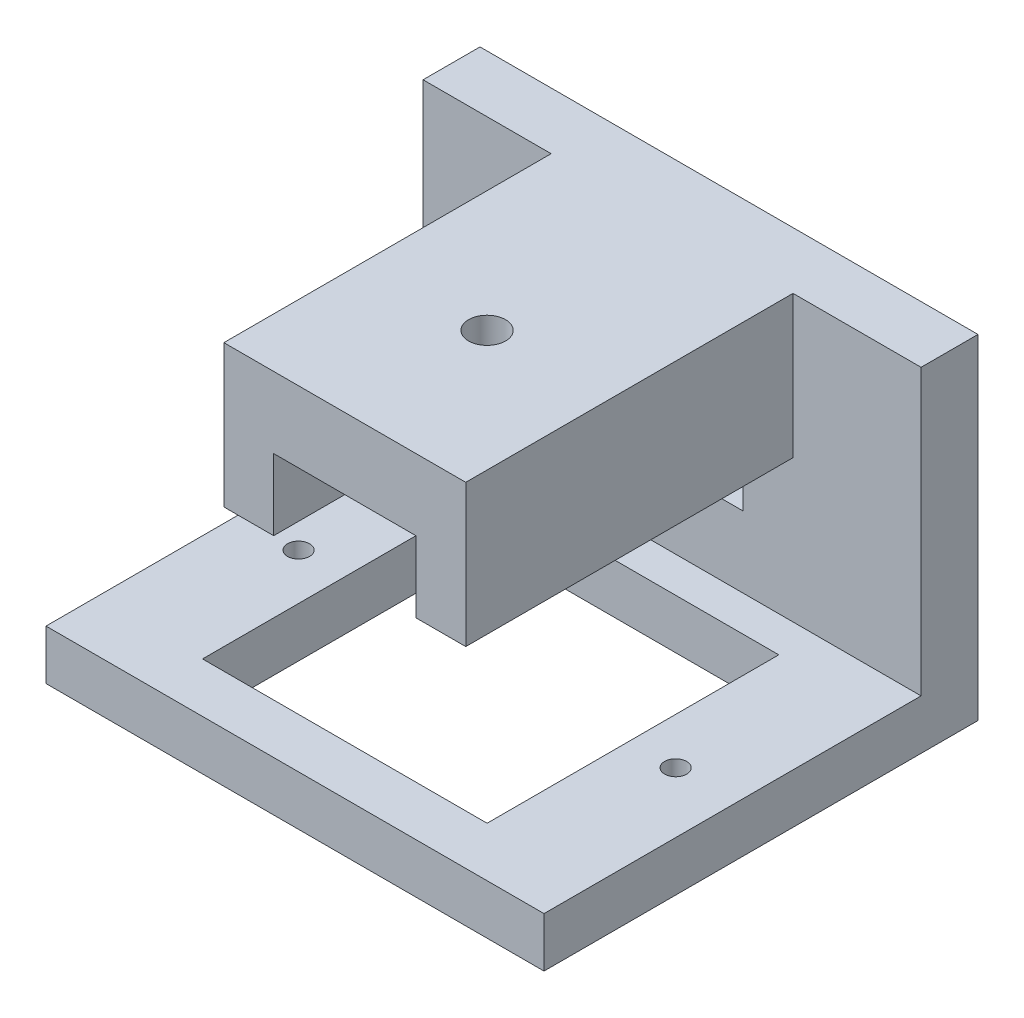
ISO-10303-21;
HEADER;
FILE_DESCRIPTION(('STEP AP214'),'2;1');
FILE_NAME('part.step','',(''),(''),'','','');
FILE_SCHEMA(('AUTOMOTIVE_DESIGN { 1 0 10303 214 1 1 1 1 }'));
ENDSEC;
DATA;
#1=APPLICATION_CONTEXT('core data for automotive mechanical design processes');
#2=APPLICATION_PROTOCOL_DEFINITION('international standard','automotive_design',2000,#1);
#3=PRODUCT_CONTEXT('',#1,'mechanical');
#4=PRODUCT('Part','Part','',(#3));
#5=PRODUCT_RELATED_PRODUCT_CATEGORY('part','',(#4));
#6=PRODUCT_DEFINITION_FORMATION('','',#4);
#7=PRODUCT_DEFINITION_CONTEXT('part definition',#1,'design');
#8=PRODUCT_DEFINITION('design','',#6,#7);
#9=PRODUCT_DEFINITION_SHAPE('','',#8);
#10=(LENGTH_UNIT() NAMED_UNIT(*) SI_UNIT(.MILLI.,.METRE.));
#11=(NAMED_UNIT(*) PLANE_ANGLE_UNIT() SI_UNIT($,.RADIAN.));
#12=(NAMED_UNIT(*) SI_UNIT($,.STERADIAN.) SOLID_ANGLE_UNIT());
#13=UNCERTAINTY_MEASURE_WITH_UNIT(LENGTH_MEASURE(1.E-05),#10,'distance_accuracy_value','');
#14=(GEOMETRIC_REPRESENTATION_CONTEXT(3) GLOBAL_UNCERTAINTY_ASSIGNED_CONTEXT((#13)) GLOBAL_UNIT_ASSIGNED_CONTEXT((#10,
#11,#12)) REPRESENTATION_CONTEXT('',''));
#15=CARTESIAN_POINT('',(0.,0.,0.));
#16=DIRECTION('',(0.,0.,1.));
#17=DIRECTION('',(1.,0.,0.));
#18=AXIS2_PLACEMENT_3D('',#15,#16,#17);
#19=CARTESIAN_POINT('',(0.,47.,-46.));
#20=DIRECTION('',(0.,0.,-1.));
#21=DIRECTION('',(-1.,0.,0.));
#22=AXIS2_PLACEMENT_3D('',#19,#20,#21);
#23=PLANE('',#22);
#24=DIRECTION('',(0.,1.,0.));
#25=VECTOR('',#24,1.);
#26=CARTESIAN_POINT('',(52.,47.,-46.));
#27=LINE('',#26,#25);
#28=CARTESIAN_POINT('',(52.,27.,-46.));
#29=VERTEX_POINT('',#28);
#30=CARTESIAN_POINT('',(52.,47.,-46.));
#31=VERTEX_POINT('',#30);
#32=EDGE_CURVE('E866',#29,#31,#27,.T.);
#33=ORIENTED_EDGE('',*,*,#32,.F.);
#34=DIRECTION('',(1.,0.,0.));
#35=VECTOR('',#34,1.);
#36=CARTESIAN_POINT('',(52.,27.,-46.));
#37=LINE('',#36,#35);
#38=CARTESIAN_POINT('',(45.,27.,-46.));
#39=VERTEX_POINT('',#38);
#40=EDGE_CURVE('E1071',#39,#29,#37,.T.);
#41=ORIENTED_EDGE('',*,*,#40,.F.);
#42=DIRECTION('',(0.,-1.,0.));
#43=VECTOR('',#42,1.);
#44=CARTESIAN_POINT('',(45.,47.,-46.));
#45=LINE('',#44,#43);
#46=CARTESIAN_POINT('',(45.,17.,-46.));
#47=VERTEX_POINT('',#46);
#48=EDGE_CURVE('E14',#39,#47,#45,.T.);
#49=ORIENTED_EDGE('',*,*,#48,.T.);
#50=DIRECTION('',(-1.,0.,0.));
#51=VECTOR('',#50,1.);
#52=CARTESIAN_POINT('',(0.,17.,-46.));
#53=LINE('',#52,#51);
#54=CARTESIAN_POINT('',(25.,17.,-46.));
#55=VERTEX_POINT('',#54);
#56=EDGE_CURVE('E1222',#47,#55,#53,.T.);
#57=ORIENTED_EDGE('',*,*,#56,.T.);
#58=DIRECTION('',(0.,1.,0.));
#59=VECTOR('',#58,1.);
#60=CARTESIAN_POINT('',(25.,47.,-46.));
#61=LINE('',#60,#59);
#62=CARTESIAN_POINT('',(25.,27.,-46.));
#63=VERTEX_POINT('',#62);
#64=EDGE_CURVE('E862',#55,#63,#61,.T.);
#65=ORIENTED_EDGE('',*,*,#64,.T.);
#66=DIRECTION('',(1.,0.,0.));
#67=VECTOR('',#66,1.);
#68=CARTESIAN_POINT('',(25.,27.,-46.));
#69=LINE('',#68,#67);
#70=CARTESIAN_POINT('',(18.,27.,-46.));
#71=VERTEX_POINT('',#70);
#72=EDGE_CURVE('E873',#71,#63,#69,.T.);
#73=ORIENTED_EDGE('',*,*,#72,.F.);
#74=DIRECTION('',(0.,-1.,0.));
#75=VECTOR('',#74,1.);
#76=CARTESIAN_POINT('',(18.,27.,-46.));
#77=LINE('',#76,#75);
#78=CARTESIAN_POINT('',(18.,47.,-46.));
#79=VERTEX_POINT('',#78);
#80=EDGE_CURVE('E1069',#79,#71,#77,.T.);
#81=ORIENTED_EDGE('',*,*,#80,.F.);
#82=DIRECTION('',(1.,0.,0.));
#83=VECTOR('',#82,1.);
#84=CARTESIAN_POINT('',(0.,47.,-46.));
#85=LINE('',#84,#83);
#86=CARTESIAN_POINT('',(0.,47.,-46.));
#87=VERTEX_POINT('',#86);
#88=EDGE_CURVE('E1131',#87,#79,#85,.T.);
#89=ORIENTED_EDGE('',*,*,#88,.F.);
#90=DIRECTION('',(0.,-1.,0.));
#91=VECTOR('',#90,1.);
#92=CARTESIAN_POINT('',(0.,47.,-46.));
#93=LINE('',#92,#91);
#94=CARTESIAN_POINT('',(0.,7.,-46.));
#95=VERTEX_POINT('',#94);
#96=EDGE_CURVE('E1153',#87,#95,#93,.T.);
#97=ORIENTED_EDGE('',*,*,#96,.T.);
#98=DIRECTION('',(1.,0.,0.));
#99=VECTOR('',#98,1.);
#100=CARTESIAN_POINT('',(0.,7.,-46.));
#101=LINE('',#100,#99);
#102=CARTESIAN_POINT('',(70.,7.,-46.));
#103=VERTEX_POINT('',#102);
#104=EDGE_CURVE('E1119',#95,#103,#101,.T.);
#105=ORIENTED_EDGE('',*,*,#104,.T.);
#106=DIRECTION('',(0.,-1.,0.));
#107=VECTOR('',#106,1.);
#108=CARTESIAN_POINT('',(70.,47.,-46.));
#109=LINE('',#108,#107);
#110=CARTESIAN_POINT('',(70.,47.,-46.));
#111=VERTEX_POINT('',#110);
#112=EDGE_CURVE('E1146',#111,#103,#109,.T.);
#113=ORIENTED_EDGE('',*,*,#112,.F.);
#114=EDGE_CURVE('E1135',#31,#111,#85,.T.);
#115=ORIENTED_EDGE('',*,*,#114,.F.);
#116=EDGE_LOOP('',(#33,#41,#49,#57,#65,#73,#81,#89,#97,#105,#113,#115));
#117=FACE_BOUND('',#116,.T.);
#118=ADVANCED_FACE('F852',(#117),#23,.F.);
#119=CARTESIAN_POINT('',(55.,7.,0.));
#120=DIRECTION('',(-1.,0.,0.));
#121=DIRECTION('',(0.,0.,1.));
#122=AXIS2_PLACEMENT_3D('',#119,#120,#121);
#123=PLANE('',#122);
#124=DIRECTION('',(0.,0.,-1.));
#125=VECTOR('',#124,1.);
#126=CARTESIAN_POINT('',(55.,0.,0.));
#127=LINE('',#126,#125);
#128=CARTESIAN_POINT('',(55.,0.,0.));
#129=VERTEX_POINT('',#128);
#130=CARTESIAN_POINT('',(55.,0.,-41.));
#131=VERTEX_POINT('',#130);
#132=EDGE_CURVE('E1165',#129,#131,#127,.T.);
#133=ORIENTED_EDGE('',*,*,#132,.F.);
#134=DIRECTION('',(0.,-1.,0.));
#135=VECTOR('',#134,1.);
#136=CARTESIAN_POINT('',(55.,7.,0.));
#137=LINE('',#136,#135);
#138=CARTESIAN_POINT('',(55.,7.,0.));
#139=VERTEX_POINT('',#138);
#140=EDGE_CURVE('E1217',#139,#129,#137,.T.);
#141=ORIENTED_EDGE('',*,*,#140,.F.);
#142=DIRECTION('',(0.,0.,-1.));
#143=VECTOR('',#142,1.);
#144=CARTESIAN_POINT('',(55.,7.,0.));
#145=LINE('',#144,#143);
#146=CARTESIAN_POINT('',(55.,7.,-41.));
#147=VERTEX_POINT('',#146);
#148=EDGE_CURVE('E1174',#139,#147,#145,.T.);
#149=ORIENTED_EDGE('',*,*,#148,.T.);
#150=DIRECTION('',(0.,-1.,0.));
#151=VECTOR('',#150,1.);
#152=CARTESIAN_POINT('',(55.,7.,-41.));
#153=LINE('',#152,#151);
#154=EDGE_CURVE('E1193',#147,#131,#153,.T.);
#155=ORIENTED_EDGE('',*,*,#154,.T.);
#156=EDGE_LOOP('',(#133,#141,#149,#155));
#157=FACE_BOUND('',#156,.T.);
#158=ADVANCED_FACE('F855',(#157),#123,.T.);
#159=CARTESIAN_POINT('',(70.,7.,0.));
#160=DIRECTION('',(-1.,0.,0.));
#161=DIRECTION('',(0.,0.,1.));
#162=AXIS2_PLACEMENT_3D('',#159,#160,#161);
#163=PLANE('',#162);
#164=DIRECTION('',(0.,0.,-1.));
#165=VECTOR('',#164,1.);
#166=CARTESIAN_POINT('',(70.,0.,0.));
#167=LINE('',#166,#165);
#168=CARTESIAN_POINT('',(70.,0.,7.));
#169=VERTEX_POINT('',#168);
#170=CARTESIAN_POINT('',(70.,0.,-54.));
#171=VERTEX_POINT('',#170);
#172=EDGE_CURVE('E1006',#169,#171,#167,.T.);
#173=ORIENTED_EDGE('',*,*,#172,.T.);
#174=DIRECTION('',(0.,-1.,0.));
#175=VECTOR('',#174,1.);
#176=CARTESIAN_POINT('',(70.,7.,-54.));
#177=LINE('',#176,#175);
#178=CARTESIAN_POINT('',(70.,47.,-54.));
#179=VERTEX_POINT('',#178);
#180=EDGE_CURVE('E1216',#179,#171,#177,.T.);
#181=ORIENTED_EDGE('',*,*,#180,.F.);
#182=DIRECTION('',(0.,0.,-1.));
#183=VECTOR('',#182,1.);
#184=CARTESIAN_POINT('',(70.,47.,-54.));
#185=LINE('',#184,#183);
#186=EDGE_CURVE('E1136',#111,#179,#185,.T.);
#187=ORIENTED_EDGE('',*,*,#186,.F.);
#188=ORIENTED_EDGE('',*,*,#112,.T.);
#189=DIRECTION('',(0.,0.,-1.));
#190=VECTOR('',#189,1.);
#191=CARTESIAN_POINT('',(70.,7.,0.));
#192=LINE('',#191,#190);
#193=CARTESIAN_POINT('',(70.,7.,7.));
#194=VERTEX_POINT('',#193);
#195=EDGE_CURVE('E1180',#194,#103,#192,.T.);
#196=ORIENTED_EDGE('',*,*,#195,.F.);
#197=DIRECTION('',(0.,1.,0.));
#198=VECTOR('',#197,1.);
#199=CARTESIAN_POINT('',(70.,7.,7.));
#200=LINE('',#199,#198);
#201=EDGE_CURVE('E1011',#169,#194,#200,.T.);
#202=ORIENTED_EDGE('',*,*,#201,.F.);
#203=EDGE_LOOP('',(#173,#181,#187,#188,#196,#202));
#204=FACE_BOUND('',#203,.T.);
#205=ADVANCED_FACE('F1275',(#204),#163,.F.);
#206=CARTESIAN_POINT('',(0.,7.,-54.));
#207=DIRECTION('',(0.,0.,-1.));
#208=DIRECTION('',(-1.,0.,0.));
#209=AXIS2_PLACEMENT_3D('',#206,#207,#208);
#210=PLANE('',#209);
#211=DIRECTION('',(0.,-1.,0.));
#212=VECTOR('',#211,1.);
#213=CARTESIAN_POINT('',(45.,37.,-54.));
#214=LINE('',#213,#212);
#215=CARTESIAN_POINT('',(45.,37.,-54.));
#216=VERTEX_POINT('',#215);
#217=CARTESIAN_POINT('',(45.,17.,-54.));
#218=VERTEX_POINT('',#217);
#219=EDGE_CURVE('E1098',#216,#218,#214,.T.);
#220=ORIENTED_EDGE('',*,*,#219,.F.);
#221=DIRECTION('',(1.,0.,0.));
#222=VECTOR('',#221,1.);
#223=CARTESIAN_POINT('',(45.,37.,-54.));
#224=LINE('',#223,#222);
#225=CARTESIAN_POINT('',(25.,37.,-54.));
#226=VERTEX_POINT('',#225);
#227=EDGE_CURVE('E1112',#226,#216,#224,.T.);
#228=ORIENTED_EDGE('',*,*,#227,.F.);
#229=DIRECTION('',(0.,1.,0.));
#230=VECTOR('',#229,1.);
#231=CARTESIAN_POINT('',(25.,37.,-54.));
#232=LINE('',#231,#230);
#233=CARTESIAN_POINT('',(25.,17.,-54.));
#234=VERTEX_POINT('',#233);
#235=EDGE_CURVE('E1110',#234,#226,#232,.T.);
#236=ORIENTED_EDGE('',*,*,#235,.F.);
#237=DIRECTION('',(-1.,0.,0.));
#238=VECTOR('',#237,1.);
#239=CARTESIAN_POINT('',(45.,17.,-54.));
#240=LINE('',#239,#238);
#241=EDGE_CURVE('E1104',#218,#234,#240,.T.);
#242=ORIENTED_EDGE('',*,*,#241,.F.);
#243=EDGE_LOOP('',(#220,#228,#236,#242));
#244=FACE_BOUND('',#243,.T.);
#245=DIRECTION('',(1.,0.,0.));
#246=VECTOR('',#245,1.);
#247=CARTESIAN_POINT('',(0.,0.,-54.));
#248=LINE('',#247,#246);
#249=CARTESIAN_POINT('',(0.,0.,-54.));
#250=VERTEX_POINT('',#249);
#251=EDGE_CURVE('E1002',#250,#171,#248,.T.);
#252=ORIENTED_EDGE('',*,*,#251,.F.);
#253=DIRECTION('',(0.,-1.,0.));
#254=VECTOR('',#253,1.);
#255=CARTESIAN_POINT('',(0.,7.,-54.));
#256=LINE('',#255,#254);
#257=CARTESIAN_POINT('',(0.,47.,-54.));
#258=VERTEX_POINT('',#257);
#259=EDGE_CURVE('E993',#258,#250,#256,.T.);
#260=ORIENTED_EDGE('',*,*,#259,.F.);
#261=DIRECTION('',(-1.,0.,0.));
#262=VECTOR('',#261,1.);
#263=CARTESIAN_POINT('',(0.,47.,-54.));
#264=LINE('',#263,#262);
#265=EDGE_CURVE('E1145',#179,#258,#264,.T.);
#266=ORIENTED_EDGE('',*,*,#265,.F.);
#267=ORIENTED_EDGE('',*,*,#180,.T.);
#268=EDGE_LOOP('',(#252,#260,#266,#267));
#269=FACE_BOUND('',#268,.T.);
#270=ADVANCED_FACE('F1274',(#244,#269),#210,.T.);
#271=CARTESIAN_POINT('',(0.,7.,0.));
#272=DIRECTION('',(-1.,0.,0.));
#273=DIRECTION('',(0.,0.,1.));
#274=AXIS2_PLACEMENT_3D('',#271,#272,#273);
#275=PLANE('',#274);
#276=DIRECTION('',(0.,0.,-1.));
#277=VECTOR('',#276,1.);
#278=CARTESIAN_POINT('',(0.,0.,0.));
#279=LINE('',#278,#277);
#280=CARTESIAN_POINT('',(0.,0.,7.));
#281=VERTEX_POINT('',#280);
#282=EDGE_CURVE('E986',#281,#250,#279,.T.);
#283=ORIENTED_EDGE('',*,*,#282,.F.);
#284=DIRECTION('',(0.,-1.,0.));
#285=VECTOR('',#284,1.);
#286=CARTESIAN_POINT('',(0.,7.,7.));
#287=LINE('',#286,#285);
#288=CARTESIAN_POINT('',(0.,7.,7.));
#289=VERTEX_POINT('',#288);
#290=EDGE_CURVE('E994',#289,#281,#287,.T.);
#291=ORIENTED_EDGE('',*,*,#290,.F.);
#292=DIRECTION('',(0.,0.,-1.));
#293=VECTOR('',#292,1.);
#294=CARTESIAN_POINT('',(0.,7.,0.));
#295=LINE('',#294,#293);
#296=EDGE_CURVE('E1185',#289,#95,#295,.T.);
#297=ORIENTED_EDGE('',*,*,#296,.T.);
#298=ORIENTED_EDGE('',*,*,#96,.F.);
#299=DIRECTION('',(0.,0.,1.));
#300=VECTOR('',#299,1.);
#301=CARTESIAN_POINT('',(0.,47.,-54.));
#302=LINE('',#301,#300);
#303=EDGE_CURVE('E1129',#258,#87,#302,.T.);
#304=ORIENTED_EDGE('',*,*,#303,.F.);
#305=ORIENTED_EDGE('',*,*,#259,.T.);
#306=EDGE_LOOP('',(#283,#291,#297,#298,#304,#305));
#307=FACE_BOUND('',#306,.T.);
#308=ADVANCED_FACE('F988',(#307),#275,.T.);
#309=CARTESIAN_POINT('',(15.,7.,0.));
#310=DIRECTION('',(-1.,0.,0.));
#311=DIRECTION('',(0.,0.,1.));
#312=AXIS2_PLACEMENT_3D('',#309,#310,#311);
#313=PLANE('',#312);
#314=DIRECTION('',(0.,0.,-1.));
#315=VECTOR('',#314,1.);
#316=CARTESIAN_POINT('',(15.,0.,0.));
#317=LINE('',#316,#315);
#318=CARTESIAN_POINT('',(15.,0.,0.));
#319=VERTEX_POINT('',#318);
#320=CARTESIAN_POINT('',(15.,0.,-41.));
#321=VERTEX_POINT('',#320);
#322=EDGE_CURVE('E997',#319,#321,#317,.T.);
#323=ORIENTED_EDGE('',*,*,#322,.T.);
#324=DIRECTION('',(0.,-1.,0.));
#325=VECTOR('',#324,1.);
#326=CARTESIAN_POINT('',(15.,7.,-41.));
#327=LINE('',#326,#325);
#328=CARTESIAN_POINT('',(15.,7.,-41.));
#329=VERTEX_POINT('',#328);
#330=EDGE_CURVE('E1208',#329,#321,#327,.T.);
#331=ORIENTED_EDGE('',*,*,#330,.F.);
#332=DIRECTION('',(0.,0.,-1.));
#333=VECTOR('',#332,1.);
#334=CARTESIAN_POINT('',(15.,7.,0.));
#335=LINE('',#334,#333);
#336=CARTESIAN_POINT('',(15.,7.,0.));
#337=VERTEX_POINT('',#336);
#338=EDGE_CURVE('E1183',#337,#329,#335,.T.);
#339=ORIENTED_EDGE('',*,*,#338,.F.);
#340=DIRECTION('',(0.,-1.,0.));
#341=VECTOR('',#340,1.);
#342=CARTESIAN_POINT('',(15.,7.,0.));
#343=LINE('',#342,#341);
#344=EDGE_CURVE('E1207',#337,#319,#343,.T.);
#345=ORIENTED_EDGE('',*,*,#344,.T.);
#346=EDGE_LOOP('',(#323,#331,#339,#345));
#347=FACE_BOUND('',#346,.T.);
#348=ADVANCED_FACE('F1364',(#347),#313,.F.);
#349=CARTESIAN_POINT('',(0.,7.,-41.));
#350=DIRECTION('',(0.,0.,-1.));
#351=DIRECTION('',(-1.,0.,0.));
#352=AXIS2_PLACEMENT_3D('',#349,#350,#351);
#353=PLANE('',#352);
#354=DIRECTION('',(1.,0.,0.));
#355=VECTOR('',#354,1.);
#356=CARTESIAN_POINT('',(0.,0.,-41.));
#357=LINE('',#356,#355);
#358=EDGE_CURVE('E1176',#321,#131,#357,.T.);
#359=ORIENTED_EDGE('',*,*,#358,.T.);
#360=ORIENTED_EDGE('',*,*,#154,.F.);
#361=DIRECTION('',(1.,0.,0.));
#362=VECTOR('',#361,1.);
#363=CARTESIAN_POINT('',(0.,7.,-41.));
#364=LINE('',#363,#362);
#365=EDGE_CURVE('E1189',#329,#147,#364,.T.);
#366=ORIENTED_EDGE('',*,*,#365,.F.);
#367=ORIENTED_EDGE('',*,*,#330,.T.);
#368=EDGE_LOOP('',(#359,#360,#366,#367));
#369=FACE_BOUND('',#368,.T.);
#370=ADVANCED_FACE('F1278',(#369),#353,.F.);
#371=CARTESIAN_POINT('',(0.,7.,0.));
#372=DIRECTION('',(0.,1.,0.));
#373=DIRECTION('',(0.,0.,1.));
#374=AXIS2_PLACEMENT_3D('',#371,#372,#373);
#375=PLANE('',#374);
#376=DIRECTION('',(-1.,0.,0.));
#377=VECTOR('',#376,1.);
#378=CARTESIAN_POINT('',(0.,7.,7.));
#379=LINE('',#378,#377);
#380=EDGE_CURVE('E1018',#194,#289,#379,.T.);
#381=ORIENTED_EDGE('',*,*,#380,.F.);
#382=ORIENTED_EDGE('',*,*,#195,.T.);
#383=ORIENTED_EDGE('',*,*,#104,.F.);
#384=ORIENTED_EDGE('',*,*,#296,.F.);
#385=EDGE_LOOP('',(#381,#382,#383,#384));
#386=FACE_BOUND('',#385,.T.);
#387=ORIENTED_EDGE('',*,*,#148,.F.);
#388=DIRECTION('',(-1.,0.,0.));
#389=VECTOR('',#388,1.);
#390=CARTESIAN_POINT('',(0.,7.,0.));
#391=LINE('',#390,#389);
#392=EDGE_CURVE('E1019',#139,#337,#391,.T.);
#393=ORIENTED_EDGE('',*,*,#392,.T.);
#394=ORIENTED_EDGE('',*,*,#338,.T.);
#395=ORIENTED_EDGE('',*,*,#365,.T.);
#396=EDGE_LOOP('',(#387,#393,#394,#395));
#397=FACE_BOUND('',#396,.T.);
#398=CARTESIAN_POINT('',(8.5,7.,-20.));
#399=DIRECTION('',(0.,1.,0.));
#400=DIRECTION('',(0.,0.,1.));
#401=AXIS2_PLACEMENT_3D('',#398,#399,#400);
#402=CIRCLE('',#401,1.55);
#403=CARTESIAN_POINT('',(8.5,7.,-18.45));
#404=VERTEX_POINT('',#403);
#405=EDGE_CURVE('E1164',#404,#404,#402,.T.);
#406=ORIENTED_EDGE('',*,*,#405,.F.);
#407=EDGE_LOOP('',(#406));
#408=FACE_BOUND('',#407,.T.);
#409=CARTESIAN_POINT('',(61.5,7.,-20.));
#410=DIRECTION('',(0.,1.,0.));
#411=DIRECTION('',(0.,0.,1.));
#412=AXIS2_PLACEMENT_3D('',#409,#410,#411);
#413=CIRCLE('',#412,1.54999999999999);
#414=CARTESIAN_POINT('',(61.5,7.,-18.45));
#415=VERTEX_POINT('',#414);
#416=EDGE_CURVE('E1170',#415,#415,#413,.T.);
#417=ORIENTED_EDGE('',*,*,#416,.F.);
#418=EDGE_LOOP('',(#417));
#419=FACE_BOUND('',#418,.T.);
#420=ADVANCED_FACE('F1272',(#386,#397,#408,#419),#375,.T.);
#421=CARTESIAN_POINT('',(0.,0.,0.));
#422=DIRECTION('',(0.,1.,0.));
#423=DIRECTION('',(0.,0.,1.));
#424=AXIS2_PLACEMENT_3D('',#421,#422,#423);
#425=PLANE('',#424);
#426=ORIENTED_EDGE('',*,*,#172,.F.);
#427=DIRECTION('',(1.,0.,0.));
#428=VECTOR('',#427,1.);
#429=CARTESIAN_POINT('',(0.,0.,7.));
#430=LINE('',#429,#428);
#431=EDGE_CURVE('E1001',#281,#169,#430,.T.);
#432=ORIENTED_EDGE('',*,*,#431,.F.);
#433=ORIENTED_EDGE('',*,*,#282,.T.);
#434=ORIENTED_EDGE('',*,*,#251,.T.);
#435=EDGE_LOOP('',(#426,#432,#433,#434));
#436=FACE_BOUND('',#435,.T.);
#437=CARTESIAN_POINT('',(8.5,0.,-20.));
#438=DIRECTION('',(0.,1.,0.));
#439=DIRECTION('',(0.,0.,1.));
#440=AXIS2_PLACEMENT_3D('',#437,#438,#439);
#441=CIRCLE('',#440,1.55);
#442=CARTESIAN_POINT('',(8.5,0.,-18.45));
#443=VERTEX_POINT('',#442);
#444=EDGE_CURVE('E1157',#443,#443,#441,.T.);
#445=ORIENTED_EDGE('',*,*,#444,.T.);
#446=EDGE_LOOP('',(#445));
#447=FACE_BOUND('',#446,.T.);
#448=CARTESIAN_POINT('',(61.5,0.,-20.));
#449=DIRECTION('',(0.,1.,0.));
#450=DIRECTION('',(0.,0.,1.));
#451=AXIS2_PLACEMENT_3D('',#448,#449,#450);
#452=CIRCLE('',#451,1.54999999999999);
#453=CARTESIAN_POINT('',(61.5,0.,-18.45));
#454=VERTEX_POINT('',#453);
#455=EDGE_CURVE('E1160',#454,#454,#452,.T.);
#456=ORIENTED_EDGE('',*,*,#455,.T.);
#457=EDGE_LOOP('',(#456));
#458=FACE_BOUND('',#457,.T.);
#459=ORIENTED_EDGE('',*,*,#132,.T.);
#460=ORIENTED_EDGE('',*,*,#358,.F.);
#461=ORIENTED_EDGE('',*,*,#322,.F.);
#462=DIRECTION('',(1.,0.,0.));
#463=VECTOR('',#462,1.);
#464=CARTESIAN_POINT('',(0.,0.,0.));
#465=LINE('',#464,#463);
#466=EDGE_CURVE('E1024',#319,#129,#465,.T.);
#467=ORIENTED_EDGE('',*,*,#466,.T.);
#468=EDGE_LOOP('',(#459,#460,#461,#467));
#469=FACE_BOUND('',#468,.T.);
#470=ADVANCED_FACE('F1003',(#436,#447,#458,#469),#425,.F.);
#471=CARTESIAN_POINT('',(61.5,0.,-20.));
#472=DIRECTION('',(0.,1.,0.));
#473=DIRECTION('',(0.,0.,1.));
#474=AXIS2_PLACEMENT_3D('',#471,#472,#473);
#475=CYLINDRICAL_SURFACE('',#474,1.54999999999999);
#476=ORIENTED_EDGE('',*,*,#455,.F.);
#477=EDGE_LOOP('',(#476));
#478=FACE_BOUND('',#477,.T.);
#479=ORIENTED_EDGE('',*,*,#416,.T.);
#480=EDGE_LOOP('',(#479));
#481=FACE_BOUND('',#480,.T.);
#482=ADVANCED_FACE('F1290',(#478,#481),#475,.F.);
#483=CARTESIAN_POINT('',(8.5,0.,-20.));
#484=DIRECTION('',(0.,1.,0.));
#485=DIRECTION('',(0.,0.,1.));
#486=AXIS2_PLACEMENT_3D('',#483,#484,#485);
#487=CYLINDRICAL_SURFACE('',#486,1.55);
#488=ORIENTED_EDGE('',*,*,#444,.F.);
#489=EDGE_LOOP('',(#488));
#490=FACE_BOUND('',#489,.T.);
#491=ORIENTED_EDGE('',*,*,#405,.T.);
#492=EDGE_LOOP('',(#491));
#493=FACE_BOUND('',#492,.T.);
#494=ADVANCED_FACE('F1288',(#490,#493),#487,.F.);
#495=CARTESIAN_POINT('',(0.,47.,0.));
#496=DIRECTION('',(0.,1.,0.));
#497=DIRECTION('',(0.,0.,1.));
#498=AXIS2_PLACEMENT_3D('',#495,#496,#497);
#499=PLANE('',#498);
#500=CARTESIAN_POINT('',(35.,47.,-20.));
#501=DIRECTION('',(0.,1.,0.));
#502=DIRECTION('',(0.,0.,1.));
#503=AXIS2_PLACEMENT_3D('',#500,#501,#502);
#504=CIRCLE('',#503,2.6);
#505=CARTESIAN_POINT('',(35.,47.,-17.4));
#506=VERTEX_POINT('',#505);
#507=EDGE_CURVE('E1035',#506,#506,#504,.T.);
#508=ORIENTED_EDGE('',*,*,#507,.F.);
#509=EDGE_LOOP('',(#508));
#510=FACE_BOUND('',#509,.T.);
#511=ORIENTED_EDGE('',*,*,#303,.T.);
#512=ORIENTED_EDGE('',*,*,#88,.T.);
#513=DIRECTION('',(0.,0.,-1.));
#514=VECTOR('',#513,1.);
#515=CARTESIAN_POINT('',(18.,47.,0.));
#516=LINE('',#515,#514);
#517=CARTESIAN_POINT('',(18.,47.,0.));
#518=VERTEX_POINT('',#517);
#519=EDGE_CURVE('E1067',#518,#79,#516,.T.);
#520=ORIENTED_EDGE('',*,*,#519,.F.);
#521=DIRECTION('',(-1.,0.,0.));
#522=VECTOR('',#521,1.);
#523=CARTESIAN_POINT('',(18.,47.,0.));
#524=LINE('',#523,#522);
#525=CARTESIAN_POINT('',(52.,47.,0.));
#526=VERTEX_POINT('',#525);
#527=EDGE_CURVE('E1061',#526,#518,#524,.T.);
#528=ORIENTED_EDGE('',*,*,#527,.F.);
#529=DIRECTION('',(0.,0.,-1.));
#530=VECTOR('',#529,1.);
#531=CARTESIAN_POINT('',(52.,47.,0.));
#532=LINE('',#531,#530);
#533=EDGE_CURVE('E1081',#526,#31,#532,.T.);
#534=ORIENTED_EDGE('',*,*,#533,.T.);
#535=ORIENTED_EDGE('',*,*,#114,.T.);
#536=ORIENTED_EDGE('',*,*,#186,.T.);
#537=ORIENTED_EDGE('',*,*,#265,.T.);
#538=EDGE_LOOP('',(#511,#512,#520,#528,#534,#535,#536,#537));
#539=FACE_BOUND('',#538,.T.);
#540=ADVANCED_FACE('F1264',(#510,#539),#499,.T.);
#541=CARTESIAN_POINT('',(45.,37.,0.));
#542=DIRECTION('',(1.,0.,0.));
#543=DIRECTION('',(0.,0.,-1.));
#544=AXIS2_PLACEMENT_3D('',#541,#542,#543);
#545=PLANE('',#544);
#546=DIRECTION('',(0.,0.,-1.));
#547=VECTOR('',#546,1.);
#548=CARTESIAN_POINT('',(45.,37.,0.));
#549=LINE('',#548,#547);
#550=CARTESIAN_POINT('',(45.,37.,0.));
#551=VERTEX_POINT('',#550);
#552=EDGE_CURVE('E1117',#551,#216,#549,.T.);
#553=ORIENTED_EDGE('',*,*,#552,.T.);
#554=ORIENTED_EDGE('',*,*,#219,.T.);
#555=DIRECTION('',(0.,0.,-1.));
#556=VECTOR('',#555,1.);
#557=CARTESIAN_POINT('',(45.,17.,0.));
#558=LINE('',#557,#556);
#559=EDGE_CURVE('E1113',#47,#218,#558,.T.);
#560=ORIENTED_EDGE('',*,*,#559,.F.);
#561=ORIENTED_EDGE('',*,*,#48,.F.);
#562=DIRECTION('',(0.,0.,-1.));
#563=VECTOR('',#562,1.);
#564=CARTESIAN_POINT('',(45.,27.,0.));
#565=LINE('',#564,#563);
#566=CARTESIAN_POINT('',(45.,27.,0.));
#567=VERTEX_POINT('',#566);
#568=EDGE_CURVE('E1087',#567,#39,#565,.T.);
#569=ORIENTED_EDGE('',*,*,#568,.F.);
#570=DIRECTION('',(0.,-1.,0.));
#571=VECTOR('',#570,1.);
#572=CARTESIAN_POINT('',(45.,27.,0.));
#573=LINE('',#572,#571);
#574=EDGE_CURVE('E1054',#551,#567,#573,.T.);
#575=ORIENTED_EDGE('',*,*,#574,.F.);
#576=EDGE_LOOP('',(#553,#554,#560,#561,#569,#575));
#577=FACE_BOUND('',#576,.T.);
#578=ADVANCED_FACE('F1250',(#577),#545,.F.);
#579=CARTESIAN_POINT('',(45.,37.,0.));
#580=DIRECTION('',(0.,1.,0.));
#581=DIRECTION('',(0.,0.,1.));
#582=AXIS2_PLACEMENT_3D('',#579,#580,#581);
#583=PLANE('',#582);
#584=CARTESIAN_POINT('',(35.,37.,-20.));
#585=DIRECTION('',(0.,1.,0.));
#586=DIRECTION('',(0.,0.,1.));
#587=AXIS2_PLACEMENT_3D('',#584,#585,#586);
#588=CIRCLE('',#587,2.6);
#589=CARTESIAN_POINT('',(35.,37.,-17.4));
#590=VERTEX_POINT('',#589);
#591=EDGE_CURVE('E853',#590,#590,#588,.T.);
#592=ORIENTED_EDGE('',*,*,#591,.T.);
#593=EDGE_LOOP('',(#592));
#594=FACE_BOUND('',#593,.T.);
#595=DIRECTION('',(0.,0.,-1.));
#596=VECTOR('',#595,1.);
#597=CARTESIAN_POINT('',(25.,37.,0.));
#598=LINE('',#597,#596);
#599=CARTESIAN_POINT('',(25.,37.,0.));
#600=VERTEX_POINT('',#599);
#601=EDGE_CURVE('E1118',#600,#226,#598,.T.);
#602=ORIENTED_EDGE('',*,*,#601,.T.);
#603=ORIENTED_EDGE('',*,*,#227,.T.);
#604=ORIENTED_EDGE('',*,*,#552,.F.);
#605=DIRECTION('',(1.,0.,0.));
#606=VECTOR('',#605,1.);
#607=CARTESIAN_POINT('',(45.,37.,0.));
#608=LINE('',#607,#606);
#609=EDGE_CURVE('E1048',#600,#551,#608,.T.);
#610=ORIENTED_EDGE('',*,*,#609,.F.);
#611=EDGE_LOOP('',(#602,#603,#604,#610));
#612=FACE_BOUND('',#611,.T.);
#613=ADVANCED_FACE('F1245',(#594,#612),#583,.F.);
#614=CARTESIAN_POINT('',(25.,37.,0.));
#615=DIRECTION('',(-1.,0.,0.));
#616=DIRECTION('',(0.,-1.,0.));
#617=AXIS2_PLACEMENT_3D('',#614,#615,#616);
#618=PLANE('',#617);
#619=DIRECTION('',(0.,0.,-1.));
#620=VECTOR('',#619,1.);
#621=CARTESIAN_POINT('',(25.,17.,0.));
#622=LINE('',#621,#620);
#623=EDGE_CURVE('E1124',#55,#234,#622,.T.);
#624=ORIENTED_EDGE('',*,*,#623,.T.);
#625=ORIENTED_EDGE('',*,*,#235,.T.);
#626=ORIENTED_EDGE('',*,*,#601,.F.);
#627=DIRECTION('',(0.,1.,0.));
#628=VECTOR('',#627,1.);
#629=CARTESIAN_POINT('',(25.,37.,0.));
#630=LINE('',#629,#628);
#631=CARTESIAN_POINT('',(25.,27.,0.));
#632=VERTEX_POINT('',#631);
#633=EDGE_CURVE('E1047',#632,#600,#630,.T.);
#634=ORIENTED_EDGE('',*,*,#633,.F.);
#635=DIRECTION('',(0.,0.,-1.));
#636=VECTOR('',#635,1.);
#637=CARTESIAN_POINT('',(25.,27.,0.));
#638=LINE('',#637,#636);
#639=EDGE_CURVE('E1092',#632,#63,#638,.T.);
#640=ORIENTED_EDGE('',*,*,#639,.T.);
#641=ORIENTED_EDGE('',*,*,#64,.F.);
#642=EDGE_LOOP('',(#624,#625,#626,#634,#640,#641));
#643=FACE_BOUND('',#642,.T.);
#644=ADVANCED_FACE('F1240',(#643),#618,.F.);
#645=CARTESIAN_POINT('',(45.,17.,0.));
#646=DIRECTION('',(0.,-1.,0.));
#647=DIRECTION('',(0.,0.,-1.));
#648=AXIS2_PLACEMENT_3D('',#645,#646,#647);
#649=PLANE('',#648);
#650=ORIENTED_EDGE('',*,*,#559,.T.);
#651=ORIENTED_EDGE('',*,*,#241,.T.);
#652=ORIENTED_EDGE('',*,*,#623,.F.);
#653=ORIENTED_EDGE('',*,*,#56,.F.);
#654=EDGE_LOOP('',(#650,#651,#652,#653));
#655=FACE_BOUND('',#654,.T.);
#656=ADVANCED_FACE('F1314',(#655),#649,.F.);
#657=CARTESIAN_POINT('',(18.,27.,0.));
#658=DIRECTION('',(1.,0.,0.));
#659=DIRECTION('',(0.,0.,-1.));
#660=AXIS2_PLACEMENT_3D('',#657,#658,#659);
#661=PLANE('',#660);
#662=ORIENTED_EDGE('',*,*,#80,.T.);
#663=DIRECTION('',(0.,0.,-1.));
#664=VECTOR('',#663,1.);
#665=CARTESIAN_POINT('',(18.,27.,0.));
#666=LINE('',#665,#664);
#667=CARTESIAN_POINT('',(18.,27.,0.));
#668=VERTEX_POINT('',#667);
#669=EDGE_CURVE('E1100',#668,#71,#666,.T.);
#670=ORIENTED_EDGE('',*,*,#669,.F.);
#671=DIRECTION('',(0.,-1.,0.));
#672=VECTOR('',#671,1.);
#673=CARTESIAN_POINT('',(18.,27.,0.));
#674=LINE('',#673,#672);
#675=EDGE_CURVE('E1036',#518,#668,#674,.T.);
#676=ORIENTED_EDGE('',*,*,#675,.F.);
#677=ORIENTED_EDGE('',*,*,#519,.T.);
#678=EDGE_LOOP('',(#662,#670,#676,#677));
#679=FACE_BOUND('',#678,.T.);
#680=ADVANCED_FACE('F1263',(#679),#661,.F.);
#681=CARTESIAN_POINT('',(25.,27.,0.));
#682=DIRECTION('',(0.,1.,0.));
#683=DIRECTION('',(-1.,0.,0.));
#684=AXIS2_PLACEMENT_3D('',#681,#682,#683);
#685=PLANE('',#684);
#686=ORIENTED_EDGE('',*,*,#72,.T.);
#687=ORIENTED_EDGE('',*,*,#639,.F.);
#688=DIRECTION('',(1.,0.,0.));
#689=VECTOR('',#688,1.);
#690=CARTESIAN_POINT('',(25.,27.,0.));
#691=LINE('',#690,#689);
#692=EDGE_CURVE('E1041',#668,#632,#691,.T.);
#693=ORIENTED_EDGE('',*,*,#692,.F.);
#694=ORIENTED_EDGE('',*,*,#669,.T.);
#695=EDGE_LOOP('',(#686,#687,#693,#694));
#696=FACE_BOUND('',#695,.T.);
#697=ADVANCED_FACE('F1231',(#696),#685,.F.);
#698=CARTESIAN_POINT('',(52.,27.,0.));
#699=DIRECTION('',(0.,1.,0.));
#700=DIRECTION('',(-1.,0.,0.));
#701=AXIS2_PLACEMENT_3D('',#698,#699,#700);
#702=PLANE('',#701);
#703=ORIENTED_EDGE('',*,*,#40,.T.);
#704=DIRECTION('',(0.,0.,-1.));
#705=VECTOR('',#704,1.);
#706=CARTESIAN_POINT('',(52.,27.,0.));
#707=LINE('',#706,#705);
#708=CARTESIAN_POINT('',(52.,27.,0.));
#709=VERTEX_POINT('',#708);
#710=EDGE_CURVE('E1084',#709,#29,#707,.T.);
#711=ORIENTED_EDGE('',*,*,#710,.F.);
#712=DIRECTION('',(1.,0.,0.));
#713=VECTOR('',#712,1.);
#714=CARTESIAN_POINT('',(52.,27.,0.));
#715=LINE('',#714,#713);
#716=EDGE_CURVE('E1060',#567,#709,#715,.T.);
#717=ORIENTED_EDGE('',*,*,#716,.F.);
#718=ORIENTED_EDGE('',*,*,#568,.T.);
#719=EDGE_LOOP('',(#703,#711,#717,#718));
#720=FACE_BOUND('',#719,.T.);
#721=ADVANCED_FACE('F1258',(#720),#702,.F.);
#722=CARTESIAN_POINT('',(52.,47.,0.));
#723=DIRECTION('',(-1.,0.,0.));
#724=DIRECTION('',(0.,0.,1.));
#725=AXIS2_PLACEMENT_3D('',#722,#723,#724);
#726=PLANE('',#725);
#727=ORIENTED_EDGE('',*,*,#32,.T.);
#728=ORIENTED_EDGE('',*,*,#533,.F.);
#729=DIRECTION('',(0.,1.,0.));
#730=VECTOR('',#729,1.);
#731=CARTESIAN_POINT('',(52.,47.,0.));
#732=LINE('',#731,#730);
#733=EDGE_CURVE('E1058',#709,#526,#732,.T.);
#734=ORIENTED_EDGE('',*,*,#733,.F.);
#735=ORIENTED_EDGE('',*,*,#710,.T.);
#736=EDGE_LOOP('',(#727,#728,#734,#735));
#737=FACE_BOUND('',#736,.T.);
#738=ADVANCED_FACE('F1256',(#737),#726,.F.);
#739=CARTESIAN_POINT('',(0.,0.,0.));
#740=DIRECTION('',(0.,0.,-1.));
#741=DIRECTION('',(-1.,0.,0.));
#742=AXIS2_PLACEMENT_3D('',#739,#740,#741);
#743=PLANE('',#742);
#744=ORIENTED_EDGE('',*,*,#675,.T.);
#745=ORIENTED_EDGE('',*,*,#692,.T.);
#746=ORIENTED_EDGE('',*,*,#633,.T.);
#747=ORIENTED_EDGE('',*,*,#609,.T.);
#748=ORIENTED_EDGE('',*,*,#574,.T.);
#749=ORIENTED_EDGE('',*,*,#716,.T.);
#750=ORIENTED_EDGE('',*,*,#733,.T.);
#751=ORIENTED_EDGE('',*,*,#527,.T.);
#752=EDGE_LOOP('',(#744,#745,#746,#747,#748,#749,#750,#751));
#753=FACE_BOUND('',#752,.T.);
#754=ADVANCED_FACE('F1237',(#753),#743,.F.);
#755=CARTESIAN_POINT('',(35.,0.,-20.));
#756=DIRECTION('',(0.,1.,0.));
#757=DIRECTION('',(0.,0.,1.));
#758=AXIS2_PLACEMENT_3D('',#755,#756,#757);
#759=CYLINDRICAL_SURFACE('',#758,2.6);
#760=ORIENTED_EDGE('',*,*,#507,.T.);
#761=EDGE_LOOP('',(#760));
#762=FACE_BOUND('',#761,.T.);
#763=ORIENTED_EDGE('',*,*,#591,.F.);
#764=EDGE_LOOP('',(#763));
#765=FACE_BOUND('',#764,.T.);
#766=ADVANCED_FACE('F1332',(#762,#765),#759,.F.);
#767=CARTESIAN_POINT('',(0.,0.,0.));
#768=DIRECTION('',(0.,0.,1.));
#769=DIRECTION('',(1.,0.,0.));
#770=AXIS2_PLACEMENT_3D('',#767,#768,#769);
#771=PLANE('',#770);
#772=ORIENTED_EDGE('',*,*,#392,.F.);
#773=ORIENTED_EDGE('',*,*,#140,.T.);
#774=ORIENTED_EDGE('',*,*,#466,.F.);
#775=ORIENTED_EDGE('',*,*,#344,.F.);
#776=EDGE_LOOP('',(#772,#773,#774,#775));
#777=FACE_BOUND('',#776,.T.);
#778=ADVANCED_FACE('F1334',(#777),#771,.F.);
#779=CARTESIAN_POINT('',(0.,0.,7.));
#780=DIRECTION('',(0.,0.,1.));
#781=DIRECTION('',(1.,0.,0.));
#782=AXIS2_PLACEMENT_3D('',#779,#780,#781);
#783=PLANE('',#782);
#784=ORIENTED_EDGE('',*,*,#290,.T.);
#785=ORIENTED_EDGE('',*,*,#431,.T.);
#786=ORIENTED_EDGE('',*,*,#201,.T.);
#787=ORIENTED_EDGE('',*,*,#380,.T.);
#788=EDGE_LOOP('',(#784,#785,#786,#787));
#789=FACE_BOUND('',#788,.T.);
#790=ADVANCED_FACE('F1016',(#789),#783,.T.);
#791=CLOSED_SHELL('',(#118,#158,#205,#270,#308,#348,#370,#420,#470,#482,#494,#540,#578,#613,
#644,#656,#680,#697,#721,#738,#754,#766,#778,#790));
#792=MANIFOLD_SOLID_BREP('B2',#791);
#793=ADVANCED_BREP_SHAPE_REPRESENTATION('',(#18,#792),#14);
#794=SHAPE_DEFINITION_REPRESENTATION(#9,#793);
ENDSEC;
END-ISO-10303-21;
